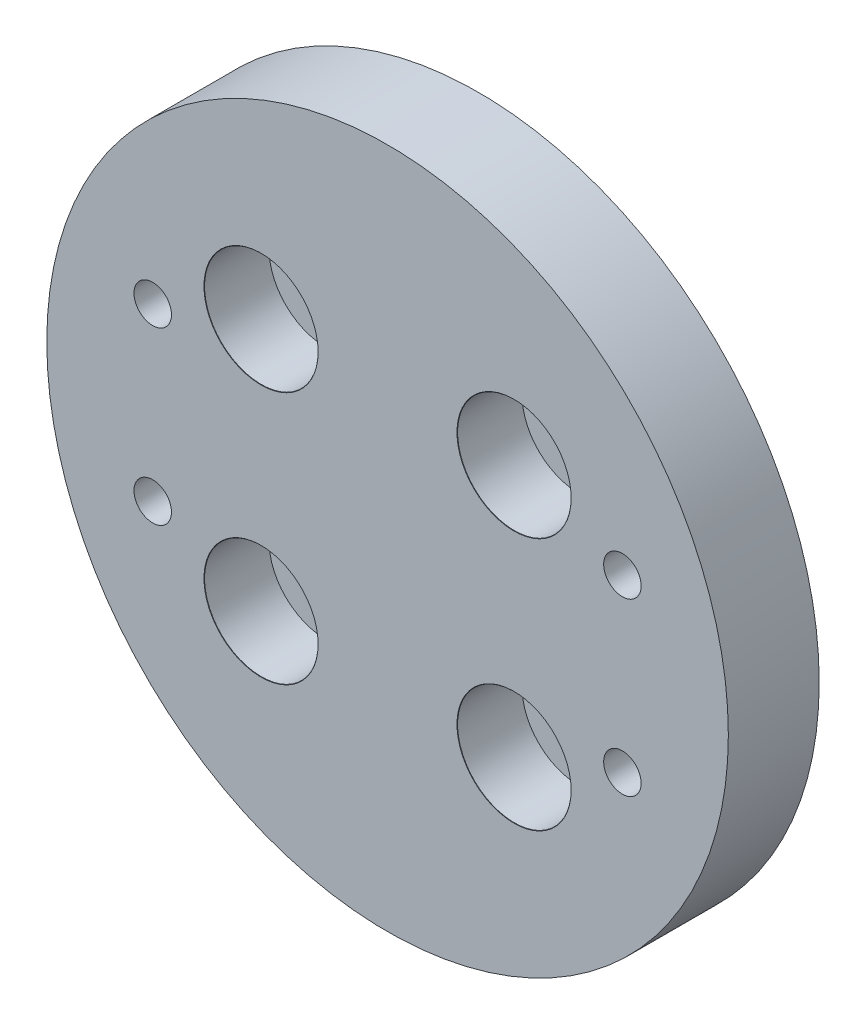
ISO-10303-21;
HEADER;
FILE_DESCRIPTION(('STEP AP214'),'2;1');
FILE_NAME('part.step','',(''),(''),'','','');
FILE_SCHEMA(('AUTOMOTIVE_DESIGN { 1 0 10303 214 1 1 1 1 }'));
ENDSEC;
DATA;
#1=APPLICATION_CONTEXT('core data for automotive mechanical design processes');
#2=APPLICATION_PROTOCOL_DEFINITION('international standard','automotive_design',2000,#1);
#3=PRODUCT_CONTEXT('',#1,'mechanical');
#4=PRODUCT('Part','Part','',(#3));
#5=PRODUCT_RELATED_PRODUCT_CATEGORY('part','',(#4));
#6=PRODUCT_DEFINITION_FORMATION('','',#4);
#7=PRODUCT_DEFINITION_CONTEXT('part definition',#1,'design');
#8=PRODUCT_DEFINITION('design','',#6,#7);
#9=PRODUCT_DEFINITION_SHAPE('','',#8);
#10=(LENGTH_UNIT() NAMED_UNIT(*) SI_UNIT(.MILLI.,.METRE.));
#11=(NAMED_UNIT(*) PLANE_ANGLE_UNIT() SI_UNIT($,.RADIAN.));
#12=(NAMED_UNIT(*) SI_UNIT($,.STERADIAN.) SOLID_ANGLE_UNIT());
#13=UNCERTAINTY_MEASURE_WITH_UNIT(LENGTH_MEASURE(1.E-05),#10,'distance_accuracy_value','');
#14=(GEOMETRIC_REPRESENTATION_CONTEXT(3) GLOBAL_UNCERTAINTY_ASSIGNED_CONTEXT((#13)) GLOBAL_UNIT_ASSIGNED_CONTEXT((#10,
#11,#12)) REPRESENTATION_CONTEXT('',''));
#15=CARTESIAN_POINT('',(0.,0.,0.));
#16=DIRECTION('',(0.,0.,1.));
#17=DIRECTION('',(1.,0.,0.));
#18=AXIS2_PLACEMENT_3D('',#15,#16,#17);
#19=CARTESIAN_POINT('',(0.,0.,8.));
#20=DIRECTION('',(0.,0.,-1.));
#21=DIRECTION('',(-1.,0.,0.));
#22=AXIS2_PLACEMENT_3D('',#19,#20,#21);
#23=CYLINDRICAL_SURFACE('',#22,30.);
#24=CARTESIAN_POINT('',(0.,0.,8.));
#25=DIRECTION('',(0.,0.,1.));
#26=DIRECTION('',(1.,0.,0.));
#27=AXIS2_PLACEMENT_3D('',#24,#25,#26);
#28=CIRCLE('',#27,30.);
#29=CARTESIAN_POINT('',(30.,0.,8.));
#30=VERTEX_POINT('',#29);
#31=EDGE_CURVE('E10',#30,#30,#28,.T.);
#32=ORIENTED_EDGE('',*,*,#31,.F.);
#33=EDGE_LOOP('',(#32));
#34=FACE_BOUND('',#33,.T.);
#35=CARTESIAN_POINT('',(0.,0.,0.));
#36=DIRECTION('',(0.,0.,1.));
#37=DIRECTION('',(1.,0.,0.));
#38=AXIS2_PLACEMENT_3D('',#35,#36,#37);
#39=CIRCLE('',#38,30.);
#40=CARTESIAN_POINT('',(30.,0.,0.));
#41=VERTEX_POINT('',#40);
#42=EDGE_CURVE('E39',#41,#41,#39,.T.);
#43=ORIENTED_EDGE('',*,*,#42,.T.);
#44=EDGE_LOOP('',(#43));
#45=FACE_BOUND('',#44,.T.);
#46=ADVANCED_FACE('F36',(#34,#45),#23,.T.);
#47=CARTESIAN_POINT('',(0.,0.,8.));
#48=DIRECTION('',(0.,0.,1.));
#49=DIRECTION('',(1.,0.,0.));
#50=AXIS2_PLACEMENT_3D('',#47,#48,#49);
#51=PLANE('',#50);
#52=CARTESIAN_POINT('',(20.67323765729,7.52444315316473,8.));
#53=DIRECTION('',(0.,0.,1.));
#54=DIRECTION('',(1.,0.,0.));
#55=AXIS2_PLACEMENT_3D('',#52,#53,#54);
#56=CIRCLE('',#55,1.64999999999999);
#57=CARTESIAN_POINT('',(22.32323765729,7.52444315316473,8.));
#58=VERTEX_POINT('',#57);
#59=EDGE_CURVE('E128',#58,#58,#56,.T.);
#60=ORIENTED_EDGE('',*,*,#59,.F.);
#61=EDGE_LOOP('',(#60));
#62=FACE_BOUND('',#61,.T.);
#63=CARTESIAN_POINT('',(20.67323765729,-7.52444315316473,8.));
#64=DIRECTION('',(0.,0.,1.));
#65=DIRECTION('',(1.,0.,0.));
#66=AXIS2_PLACEMENT_3D('',#63,#64,#65);
#67=CIRCLE('',#66,1.64999999999999);
#68=CARTESIAN_POINT('',(22.32323765729,-7.52444315316473,8.));
#69=VERTEX_POINT('',#68);
#70=EDGE_CURVE('E122',#69,#69,#67,.T.);
#71=ORIENTED_EDGE('',*,*,#70,.F.);
#72=EDGE_LOOP('',(#71));
#73=FACE_BOUND('',#72,.T.);
#74=CARTESIAN_POINT('',(-20.67323765729,7.52444315316473,8.));
#75=DIRECTION('',(0.,0.,1.));
#76=DIRECTION('',(1.,0.,0.));
#77=AXIS2_PLACEMENT_3D('',#74,#75,#76);
#78=CIRCLE('',#77,1.64999999999999);
#79=CARTESIAN_POINT('',(-19.02323765729,7.52444315316473,8.));
#80=VERTEX_POINT('',#79);
#81=EDGE_CURVE('E116',#80,#80,#78,.T.);
#82=ORIENTED_EDGE('',*,*,#81,.F.);
#83=EDGE_LOOP('',(#82));
#84=FACE_BOUND('',#83,.T.);
#85=CARTESIAN_POINT('',(-20.67323765729,-7.52444315316473,8.));
#86=DIRECTION('',(0.,0.,1.));
#87=DIRECTION('',(1.,0.,0.));
#88=AXIS2_PLACEMENT_3D('',#85,#86,#87);
#89=CIRCLE('',#88,1.64999999999999);
#90=CARTESIAN_POINT('',(-19.02323765729,-7.52444315316473,8.));
#91=VERTEX_POINT('',#90);
#92=EDGE_CURVE('E110',#91,#91,#89,.T.);
#93=ORIENTED_EDGE('',*,*,#92,.F.);
#94=EDGE_LOOP('',(#93));
#95=FACE_BOUND('',#94,.T.);
#96=CARTESIAN_POINT('',(-11.136931803688,-11.1369318036883,8.));
#97=DIRECTION('',(0.,0.,1.));
#98=DIRECTION('',(1.,0.,0.));
#99=AXIS2_PLACEMENT_3D('',#96,#97,#98);
#100=CIRCLE('',#99,5.025);
#101=CARTESIAN_POINT('',(-6.11193180368798,-11.1369318036883,8.));
#102=VERTEX_POINT('',#101);
#103=EDGE_CURVE('E104',#102,#102,#100,.T.);
#104=ORIENTED_EDGE('',*,*,#103,.F.);
#105=EDGE_LOOP('',(#104));
#106=FACE_BOUND('',#105,.T.);
#107=CARTESIAN_POINT('',(-11.1369318036881,11.1369318036881,8.));
#108=DIRECTION('',(0.,0.,1.));
#109=DIRECTION('',(1.,0.,0.));
#110=AXIS2_PLACEMENT_3D('',#107,#108,#109);
#111=CIRCLE('',#110,5.025);
#112=CARTESIAN_POINT('',(-6.11193180368814,11.1369318036881,8.));
#113=VERTEX_POINT('',#112);
#114=EDGE_CURVE('E89',#113,#113,#111,.T.);
#115=ORIENTED_EDGE('',*,*,#114,.F.);
#116=EDGE_LOOP('',(#115));
#117=FACE_BOUND('',#116,.T.);
#118=CARTESIAN_POINT('',(11.1369318036881,11.1369318036882,8.));
#119=DIRECTION('',(0.,0.,1.));
#120=DIRECTION('',(1.,0.,0.));
#121=AXIS2_PLACEMENT_3D('',#118,#119,#120);
#122=CIRCLE('',#121,5.025);
#123=CARTESIAN_POINT('',(16.1619318036881,11.1369318036882,8.));
#124=VERTEX_POINT('',#123);
#125=EDGE_CURVE('E74',#124,#124,#122,.T.);
#126=ORIENTED_EDGE('',*,*,#125,.F.);
#127=EDGE_LOOP('',(#126));
#128=FACE_BOUND('',#127,.T.);
#129=CARTESIAN_POINT('',(11.1369318036881,-11.1369318036881,8.));
#130=DIRECTION('',(0.,0.,1.));
#131=DIRECTION('',(1.,0.,0.));
#132=AXIS2_PLACEMENT_3D('',#129,#130,#131);
#133=CIRCLE('',#132,5.025);
#134=CARTESIAN_POINT('',(16.1619318036881,-11.1369318036881,8.));
#135=VERTEX_POINT('',#134);
#136=EDGE_CURVE('E59',#135,#135,#133,.T.);
#137=ORIENTED_EDGE('',*,*,#136,.F.);
#138=EDGE_LOOP('',(#137));
#139=FACE_BOUND('',#138,.T.);
#140=ORIENTED_EDGE('',*,*,#31,.T.);
#141=EDGE_LOOP('',(#140));
#142=FACE_BOUND('',#141,.T.);
#143=ADVANCED_FACE('F134',(#62,#73,#84,#95,#106,#117,#128,#139,#142),#51,.T.);
#144=CARTESIAN_POINT('',(0.,0.,0.));
#145=DIRECTION('',(0.,0.,1.));
#146=DIRECTION('',(1.,0.,0.));
#147=AXIS2_PLACEMENT_3D('',#144,#145,#146);
#148=PLANE('',#147);
#149=CARTESIAN_POINT('',(20.67323765729,7.52444315316473,0.));
#150=DIRECTION('',(0.,0.,1.));
#151=DIRECTION('',(1.,0.,0.));
#152=AXIS2_PLACEMENT_3D('',#149,#150,#151);
#153=CIRCLE('',#152,1.65);
#154=CARTESIAN_POINT('',(22.32323765729,7.52444315316473,0.));
#155=VERTEX_POINT('',#154);
#156=EDGE_CURVE('E125',#155,#155,#153,.T.);
#157=ORIENTED_EDGE('',*,*,#156,.T.);
#158=EDGE_LOOP('',(#157));
#159=FACE_BOUND('',#158,.T.);
#160=CARTESIAN_POINT('',(20.67323765729,-7.52444315316473,0.));
#161=DIRECTION('',(0.,0.,1.));
#162=DIRECTION('',(1.,0.,0.));
#163=AXIS2_PLACEMENT_3D('',#160,#161,#162);
#164=CIRCLE('',#163,1.65);
#165=CARTESIAN_POINT('',(22.32323765729,-7.52444315316473,0.));
#166=VERTEX_POINT('',#165);
#167=EDGE_CURVE('E119',#166,#166,#164,.T.);
#168=ORIENTED_EDGE('',*,*,#167,.T.);
#169=EDGE_LOOP('',(#168));
#170=FACE_BOUND('',#169,.T.);
#171=CARTESIAN_POINT('',(-20.67323765729,7.52444315316473,0.));
#172=DIRECTION('',(0.,0.,1.));
#173=DIRECTION('',(1.,0.,0.));
#174=AXIS2_PLACEMENT_3D('',#171,#172,#173);
#175=CIRCLE('',#174,1.65);
#176=CARTESIAN_POINT('',(-19.02323765729,7.52444315316473,0.));
#177=VERTEX_POINT('',#176);
#178=EDGE_CURVE('E113',#177,#177,#175,.T.);
#179=ORIENTED_EDGE('',*,*,#178,.T.);
#180=EDGE_LOOP('',(#179));
#181=FACE_BOUND('',#180,.T.);
#182=CARTESIAN_POINT('',(-20.67323765729,-7.52444315316473,0.));
#183=DIRECTION('',(0.,0.,1.));
#184=DIRECTION('',(1.,0.,0.));
#185=AXIS2_PLACEMENT_3D('',#182,#183,#184);
#186=CIRCLE('',#185,1.65);
#187=CARTESIAN_POINT('',(-19.02323765729,-7.52444315316473,0.));
#188=VERTEX_POINT('',#187);
#189=EDGE_CURVE('E107',#188,#188,#186,.T.);
#190=ORIENTED_EDGE('',*,*,#189,.T.);
#191=EDGE_LOOP('',(#190));
#192=FACE_BOUND('',#191,.T.);
#193=CARTESIAN_POINT('',(-11.136931803688,-11.1369318036883,0.));
#194=DIRECTION('',(0.,0.,1.));
#195=DIRECTION('',(1.,0.,0.));
#196=AXIS2_PLACEMENT_3D('',#193,#194,#195);
#197=CIRCLE('',#196,2.75);
#198=CARTESIAN_POINT('',(-8.38693180368798,-11.1369318036883,0.));
#199=VERTEX_POINT('',#198);
#200=EDGE_CURVE('E92',#199,#199,#197,.T.);
#201=ORIENTED_EDGE('',*,*,#200,.T.);
#202=EDGE_LOOP('',(#201));
#203=FACE_BOUND('',#202,.T.);
#204=CARTESIAN_POINT('',(-11.1369318036881,11.1369318036881,0.));
#205=DIRECTION('',(0.,0.,1.));
#206=DIRECTION('',(1.,0.,0.));
#207=AXIS2_PLACEMENT_3D('',#204,#205,#206);
#208=CIRCLE('',#207,2.75);
#209=CARTESIAN_POINT('',(-8.38693180368815,11.1369318036881,0.));
#210=VERTEX_POINT('',#209);
#211=EDGE_CURVE('E77',#210,#210,#208,.T.);
#212=ORIENTED_EDGE('',*,*,#211,.T.);
#213=EDGE_LOOP('',(#212));
#214=FACE_BOUND('',#213,.T.);
#215=CARTESIAN_POINT('',(11.1369318036881,11.1369318036882,0.));
#216=DIRECTION('',(0.,0.,1.));
#217=DIRECTION('',(1.,0.,0.));
#218=AXIS2_PLACEMENT_3D('',#215,#216,#217);
#219=CIRCLE('',#218,2.75);
#220=CARTESIAN_POINT('',(13.8869318036881,11.1369318036882,0.));
#221=VERTEX_POINT('',#220);
#222=EDGE_CURVE('E62',#221,#221,#219,.T.);
#223=ORIENTED_EDGE('',*,*,#222,.T.);
#224=EDGE_LOOP('',(#223));
#225=FACE_BOUND('',#224,.T.);
#226=CARTESIAN_POINT('',(11.1369318036881,-11.1369318036881,0.));
#227=DIRECTION('',(0.,0.,1.));
#228=DIRECTION('',(1.,0.,0.));
#229=AXIS2_PLACEMENT_3D('',#226,#227,#228);
#230=CIRCLE('',#229,2.75);
#231=CARTESIAN_POINT('',(13.8869318036881,-11.1369318036881,0.));
#232=VERTEX_POINT('',#231);
#233=EDGE_CURVE('E46',#232,#232,#230,.T.);
#234=ORIENTED_EDGE('',*,*,#233,.T.);
#235=EDGE_LOOP('',(#234));
#236=FACE_BOUND('',#235,.T.);
#237=ORIENTED_EDGE('',*,*,#42,.F.);
#238=EDGE_LOOP('',(#237));
#239=FACE_BOUND('',#238,.T.);
#240=ADVANCED_FACE('F137',(#159,#170,#181,#192,#203,#214,#225,#236,#239),#148,.F.);
#241=CARTESIAN_POINT('',(11.1369318036881,-11.1369318036881,8.));
#242=DIRECTION('',(0.,0.,1.));
#243=DIRECTION('',(1.,0.,0.));
#244=AXIS2_PLACEMENT_3D('',#241,#242,#243);
#245=CYLINDRICAL_SURFACE('',#244,2.75);
#246=ORIENTED_EDGE('',*,*,#233,.F.);
#247=EDGE_LOOP('',(#246));
#248=FACE_BOUND('',#247,.T.);
#249=CARTESIAN_POINT('',(11.1369318036881,-11.1369318036881,2.3));
#250=DIRECTION('',(0.,0.,1.));
#251=DIRECTION('',(1.,0.,0.));
#252=AXIS2_PLACEMENT_3D('',#249,#250,#251);
#253=CIRCLE('',#252,2.75);
#254=CARTESIAN_POINT('',(13.8869318036881,-11.1369318036881,2.3));
#255=VERTEX_POINT('',#254);
#256=EDGE_CURVE('E50',#255,#255,#253,.T.);
#257=ORIENTED_EDGE('',*,*,#256,.T.);
#258=EDGE_LOOP('',(#257));
#259=FACE_BOUND('',#258,.T.);
#260=ADVANCED_FACE('F178',(#248,#259),#245,.F.);
#261=CARTESIAN_POINT('',(16.1369318036881,-11.1369318036881,2.3));
#262=DIRECTION('',(0.,0.,-1.));
#263=DIRECTION('',(-1.,0.,0.));
#264=AXIS2_PLACEMENT_3D('',#261,#262,#263);
#265=PLANE('',#264);
#266=ORIENTED_EDGE('',*,*,#256,.F.);
#267=EDGE_LOOP('',(#266));
#268=FACE_BOUND('',#267,.T.);
#269=CARTESIAN_POINT('',(11.1369318036881,-11.1369318036881,2.3));
#270=DIRECTION('',(0.,0.,1.));
#271=DIRECTION('',(1.,0.,0.));
#272=AXIS2_PLACEMENT_3D('',#269,#270,#271);
#273=CIRCLE('',#272,5.);
#274=CARTESIAN_POINT('',(16.1369318036881,-11.1369318036881,2.3));
#275=VERTEX_POINT('',#274);
#276=EDGE_CURVE('E53',#275,#275,#273,.T.);
#277=ORIENTED_EDGE('',*,*,#276,.T.);
#278=EDGE_LOOP('',(#277));
#279=FACE_BOUND('',#278,.T.);
#280=ADVANCED_FACE('F166',(#268,#279),#265,.F.);
#281=CARTESIAN_POINT('',(11.1369318036881,-11.1369318036881,8.));
#282=DIRECTION('',(0.,0.,1.));
#283=DIRECTION('',(1.,0.,0.));
#284=AXIS2_PLACEMENT_3D('',#281,#282,#283);
#285=CYLINDRICAL_SURFACE('',#284,5.);
#286=ORIENTED_EDGE('',*,*,#276,.F.);
#287=EDGE_LOOP('',(#286));
#288=FACE_BOUND('',#287,.T.);
#289=CARTESIAN_POINT('',(11.1369318036881,-11.1369318036881,7.975));
#290=DIRECTION('',(0.,0.,1.));
#291=DIRECTION('',(1.,0.,0.));
#292=AXIS2_PLACEMENT_3D('',#289,#290,#291);
#293=CIRCLE('',#292,5.);
#294=CARTESIAN_POINT('',(16.1369318036881,-11.1369318036881,7.975));
#295=VERTEX_POINT('',#294);
#296=EDGE_CURVE('E56',#295,#295,#293,.T.);
#297=ORIENTED_EDGE('',*,*,#296,.T.);
#298=EDGE_LOOP('',(#297));
#299=FACE_BOUND('',#298,.T.);
#300=ADVANCED_FACE('F156',(#288,#299),#285,.F.);
#301=CARTESIAN_POINT('',(11.1369318036881,-11.1369318036881,8.));
#302=DIRECTION('',(0.,0.,1.));
#303=DIRECTION('',(1.,0.,0.));
#304=AXIS2_PLACEMENT_3D('',#301,#302,#303);
#305=CONICAL_SURFACE('',#304,5.025,0.785398163397379);
#306=ORIENTED_EDGE('',*,*,#296,.F.);
#307=EDGE_LOOP('',(#306));
#308=FACE_BOUND('',#307,.T.);
#309=ORIENTED_EDGE('',*,*,#136,.T.);
#310=EDGE_LOOP('',(#309));
#311=FACE_BOUND('',#310,.T.);
#312=ADVANCED_FACE('F153',(#308,#311),#305,.F.);
#313=CARTESIAN_POINT('',(11.1369318036881,11.1369318036882,8.));
#314=DIRECTION('',(0.,0.,1.));
#315=DIRECTION('',(1.,0.,0.));
#316=AXIS2_PLACEMENT_3D('',#313,#314,#315);
#317=CYLINDRICAL_SURFACE('',#316,2.75);
#318=ORIENTED_EDGE('',*,*,#222,.F.);
#319=EDGE_LOOP('',(#318));
#320=FACE_BOUND('',#319,.T.);
#321=CARTESIAN_POINT('',(11.1369318036881,11.1369318036882,2.3));
#322=DIRECTION('',(0.,0.,1.));
#323=DIRECTION('',(1.,0.,0.));
#324=AXIS2_PLACEMENT_3D('',#321,#322,#323);
#325=CIRCLE('',#324,2.75);
#326=CARTESIAN_POINT('',(13.8869318036881,11.1369318036882,2.3));
#327=VERTEX_POINT('',#326);
#328=EDGE_CURVE('E65',#327,#327,#325,.T.);
#329=ORIENTED_EDGE('',*,*,#328,.T.);
#330=EDGE_LOOP('',(#329));
#331=FACE_BOUND('',#330,.T.);
#332=ADVANCED_FACE('F155',(#320,#331),#317,.F.);
#333=CARTESIAN_POINT('',(16.1369318036881,11.1369318036882,2.3));
#334=DIRECTION('',(0.,0.,-1.));
#335=DIRECTION('',(-1.,0.,0.));
#336=AXIS2_PLACEMENT_3D('',#333,#334,#335);
#337=PLANE('',#336);
#338=ORIENTED_EDGE('',*,*,#328,.F.);
#339=EDGE_LOOP('',(#338));
#340=FACE_BOUND('',#339,.T.);
#341=CARTESIAN_POINT('',(11.1369318036881,11.1369318036882,2.3));
#342=DIRECTION('',(0.,0.,1.));
#343=DIRECTION('',(1.,0.,0.));
#344=AXIS2_PLACEMENT_3D('',#341,#342,#343);
#345=CIRCLE('',#344,5.);
#346=CARTESIAN_POINT('',(16.1369318036881,11.1369318036882,2.3));
#347=VERTEX_POINT('',#346);
#348=EDGE_CURVE('E68',#347,#347,#345,.T.);
#349=ORIENTED_EDGE('',*,*,#348,.T.);
#350=EDGE_LOOP('',(#349));
#351=FACE_BOUND('',#350,.T.);
#352=ADVANCED_FACE('F163',(#340,#351),#337,.F.);
#353=CARTESIAN_POINT('',(11.1369318036881,11.1369318036882,8.));
#354=DIRECTION('',(0.,0.,1.));
#355=DIRECTION('',(1.,0.,0.));
#356=AXIS2_PLACEMENT_3D('',#353,#354,#355);
#357=CYLINDRICAL_SURFACE('',#356,5.);
#358=ORIENTED_EDGE('',*,*,#348,.F.);
#359=EDGE_LOOP('',(#358));
#360=FACE_BOUND('',#359,.T.);
#361=CARTESIAN_POINT('',(11.1369318036881,11.1369318036882,7.975));
#362=DIRECTION('',(0.,0.,1.));
#363=DIRECTION('',(1.,0.,0.));
#364=AXIS2_PLACEMENT_3D('',#361,#362,#363);
#365=CIRCLE('',#364,5.);
#366=CARTESIAN_POINT('',(16.1369318036881,11.1369318036882,7.975));
#367=VERTEX_POINT('',#366);
#368=EDGE_CURVE('E71',#367,#367,#365,.T.);
#369=ORIENTED_EDGE('',*,*,#368,.T.);
#370=EDGE_LOOP('',(#369));
#371=FACE_BOUND('',#370,.T.);
#372=ADVANCED_FACE('F221',(#360,#371),#357,.F.);
#373=CARTESIAN_POINT('',(11.1369318036881,11.1369318036882,8.));
#374=DIRECTION('',(0.,0.,1.));
#375=DIRECTION('',(1.,0.,0.));
#376=AXIS2_PLACEMENT_3D('',#373,#374,#375);
#377=CONICAL_SURFACE('',#376,5.025,0.785398163397379);
#378=ORIENTED_EDGE('',*,*,#368,.F.);
#379=EDGE_LOOP('',(#378));
#380=FACE_BOUND('',#379,.T.);
#381=ORIENTED_EDGE('',*,*,#125,.T.);
#382=EDGE_LOOP('',(#381));
#383=FACE_BOUND('',#382,.T.);
#384=ADVANCED_FACE('F231',(#380,#383),#377,.F.);
#385=CARTESIAN_POINT('',(-11.1369318036881,11.1369318036881,8.));
#386=DIRECTION('',(0.,0.,1.));
#387=DIRECTION('',(1.,0.,0.));
#388=AXIS2_PLACEMENT_3D('',#385,#386,#387);
#389=CYLINDRICAL_SURFACE('',#388,2.75);
#390=ORIENTED_EDGE('',*,*,#211,.F.);
#391=EDGE_LOOP('',(#390));
#392=FACE_BOUND('',#391,.T.);
#393=CARTESIAN_POINT('',(-11.1369318036881,11.1369318036881,2.3));
#394=DIRECTION('',(0.,0.,1.));
#395=DIRECTION('',(1.,0.,0.));
#396=AXIS2_PLACEMENT_3D('',#393,#394,#395);
#397=CIRCLE('',#396,2.75);
#398=CARTESIAN_POINT('',(-8.38693180368815,11.1369318036881,2.3));
#399=VERTEX_POINT('',#398);
#400=EDGE_CURVE('E80',#399,#399,#397,.T.);
#401=ORIENTED_EDGE('',*,*,#400,.T.);
#402=EDGE_LOOP('',(#401));
#403=FACE_BOUND('',#402,.T.);
#404=ADVANCED_FACE('F241',(#392,#403),#389,.F.);
#405=CARTESIAN_POINT('',(-6.13693180368815,11.1369318036881,2.3));
#406=DIRECTION('',(0.,0.,-1.));
#407=DIRECTION('',(-1.,0.,0.));
#408=AXIS2_PLACEMENT_3D('',#405,#406,#407);
#409=PLANE('',#408);
#410=ORIENTED_EDGE('',*,*,#400,.F.);
#411=EDGE_LOOP('',(#410));
#412=FACE_BOUND('',#411,.T.);
#413=CARTESIAN_POINT('',(-11.1369318036881,11.1369318036881,2.3));
#414=DIRECTION('',(0.,0.,1.));
#415=DIRECTION('',(1.,0.,0.));
#416=AXIS2_PLACEMENT_3D('',#413,#414,#415);
#417=CIRCLE('',#416,5.);
#418=CARTESIAN_POINT('',(-6.13693180368815,11.1369318036881,2.3));
#419=VERTEX_POINT('',#418);
#420=EDGE_CURVE('E83',#419,#419,#417,.T.);
#421=ORIENTED_EDGE('',*,*,#420,.T.);
#422=EDGE_LOOP('',(#421));
#423=FACE_BOUND('',#422,.T.);
#424=ADVANCED_FACE('F251',(#412,#423),#409,.F.);
#425=CARTESIAN_POINT('',(-11.1369318036881,11.1369318036881,8.));
#426=DIRECTION('',(0.,0.,1.));
#427=DIRECTION('',(1.,0.,0.));
#428=AXIS2_PLACEMENT_3D('',#425,#426,#427);
#429=CYLINDRICAL_SURFACE('',#428,5.);
#430=ORIENTED_EDGE('',*,*,#420,.F.);
#431=EDGE_LOOP('',(#430));
#432=FACE_BOUND('',#431,.T.);
#433=CARTESIAN_POINT('',(-11.1369318036881,11.1369318036881,7.975));
#434=DIRECTION('',(0.,0.,1.));
#435=DIRECTION('',(1.,0.,0.));
#436=AXIS2_PLACEMENT_3D('',#433,#434,#435);
#437=CIRCLE('',#436,5.);
#438=CARTESIAN_POINT('',(-6.13693180368815,11.1369318036881,7.975));
#439=VERTEX_POINT('',#438);
#440=EDGE_CURVE('E86',#439,#439,#437,.T.);
#441=ORIENTED_EDGE('',*,*,#440,.T.);
#442=EDGE_LOOP('',(#441));
#443=FACE_BOUND('',#442,.T.);
#444=ADVANCED_FACE('F261',(#432,#443),#429,.F.);
#445=CARTESIAN_POINT('',(-11.1369318036881,11.1369318036881,8.));
#446=DIRECTION('',(0.,0.,1.));
#447=DIRECTION('',(1.,0.,0.));
#448=AXIS2_PLACEMENT_3D('',#445,#446,#447);
#449=CONICAL_SURFACE('',#448,5.025,0.785398163397396);
#450=ORIENTED_EDGE('',*,*,#440,.F.);
#451=EDGE_LOOP('',(#450));
#452=FACE_BOUND('',#451,.T.);
#453=ORIENTED_EDGE('',*,*,#114,.T.);
#454=EDGE_LOOP('',(#453));
#455=FACE_BOUND('',#454,.T.);
#456=ADVANCED_FACE('F271',(#452,#455),#449,.F.);
#457=CARTESIAN_POINT('',(-11.136931803688,-11.1369318036883,8.));
#458=DIRECTION('',(0.,0.,1.));
#459=DIRECTION('',(1.,0.,0.));
#460=AXIS2_PLACEMENT_3D('',#457,#458,#459);
#461=CYLINDRICAL_SURFACE('',#460,2.75);
#462=ORIENTED_EDGE('',*,*,#200,.F.);
#463=EDGE_LOOP('',(#462));
#464=FACE_BOUND('',#463,.T.);
#465=CARTESIAN_POINT('',(-11.136931803688,-11.1369318036883,2.3));
#466=DIRECTION('',(0.,0.,1.));
#467=DIRECTION('',(1.,0.,0.));
#468=AXIS2_PLACEMENT_3D('',#465,#466,#467);
#469=CIRCLE('',#468,2.75);
#470=CARTESIAN_POINT('',(-8.38693180368799,-11.1369318036883,2.3));
#471=VERTEX_POINT('',#470);
#472=EDGE_CURVE('E95',#471,#471,#469,.T.);
#473=ORIENTED_EDGE('',*,*,#472,.T.);
#474=EDGE_LOOP('',(#473));
#475=FACE_BOUND('',#474,.T.);
#476=ADVANCED_FACE('F281',(#464,#475),#461,.F.);
#477=CARTESIAN_POINT('',(-6.13693180368799,-11.1369318036883,2.3));
#478=DIRECTION('',(0.,0.,-1.));
#479=DIRECTION('',(-1.,0.,0.));
#480=AXIS2_PLACEMENT_3D('',#477,#478,#479);
#481=PLANE('',#480);
#482=ORIENTED_EDGE('',*,*,#472,.F.);
#483=EDGE_LOOP('',(#482));
#484=FACE_BOUND('',#483,.T.);
#485=CARTESIAN_POINT('',(-11.136931803688,-11.1369318036883,2.3));
#486=DIRECTION('',(0.,0.,1.));
#487=DIRECTION('',(1.,0.,0.));
#488=AXIS2_PLACEMENT_3D('',#485,#486,#487);
#489=CIRCLE('',#488,5.);
#490=CARTESIAN_POINT('',(-6.13693180368799,-11.1369318036883,2.3));
#491=VERTEX_POINT('',#490);
#492=EDGE_CURVE('E98',#491,#491,#489,.T.);
#493=ORIENTED_EDGE('',*,*,#492,.T.);
#494=EDGE_LOOP('',(#493));
#495=FACE_BOUND('',#494,.T.);
#496=ADVANCED_FACE('F291',(#484,#495),#481,.F.);
#497=CARTESIAN_POINT('',(-11.136931803688,-11.1369318036883,8.));
#498=DIRECTION('',(0.,0.,1.));
#499=DIRECTION('',(1.,0.,0.));
#500=AXIS2_PLACEMENT_3D('',#497,#498,#499);
#501=CYLINDRICAL_SURFACE('',#500,5.);
#502=ORIENTED_EDGE('',*,*,#492,.F.);
#503=EDGE_LOOP('',(#502));
#504=FACE_BOUND('',#503,.T.);
#505=CARTESIAN_POINT('',(-11.136931803688,-11.1369318036883,7.975));
#506=DIRECTION('',(0.,0.,1.));
#507=DIRECTION('',(1.,0.,0.));
#508=AXIS2_PLACEMENT_3D('',#505,#506,#507);
#509=CIRCLE('',#508,5.);
#510=CARTESIAN_POINT('',(-6.13693180368799,-11.1369318036883,7.975));
#511=VERTEX_POINT('',#510);
#512=EDGE_CURVE('E101',#511,#511,#509,.T.);
#513=ORIENTED_EDGE('',*,*,#512,.T.);
#514=EDGE_LOOP('',(#513));
#515=FACE_BOUND('',#514,.T.);
#516=ADVANCED_FACE('F301',(#504,#515),#501,.F.);
#517=CARTESIAN_POINT('',(-11.136931803688,-11.1369318036883,8.));
#518=DIRECTION('',(0.,0.,1.));
#519=DIRECTION('',(1.,0.,0.));
#520=AXIS2_PLACEMENT_3D('',#517,#518,#519);
#521=CONICAL_SURFACE('',#520,5.025,0.785398163397396);
#522=ORIENTED_EDGE('',*,*,#512,.F.);
#523=EDGE_LOOP('',(#522));
#524=FACE_BOUND('',#523,.T.);
#525=ORIENTED_EDGE('',*,*,#103,.T.);
#526=EDGE_LOOP('',(#525));
#527=FACE_BOUND('',#526,.T.);
#528=ADVANCED_FACE('F311',(#524,#527),#521,.F.);
#529=CARTESIAN_POINT('',(-20.67323765729,-7.52444315316473,8.));
#530=DIRECTION('',(0.,0.,1.));
#531=DIRECTION('',(1.,0.,0.));
#532=AXIS2_PLACEMENT_3D('',#529,#530,#531);
#533=CYLINDRICAL_SURFACE('',#532,1.64999999999999);
#534=ORIENTED_EDGE('',*,*,#189,.F.);
#535=EDGE_LOOP('',(#534));
#536=FACE_BOUND('',#535,.T.);
#537=ORIENTED_EDGE('',*,*,#92,.T.);
#538=EDGE_LOOP('',(#537));
#539=FACE_BOUND('',#538,.T.);
#540=ADVANCED_FACE('F321',(#536,#539),#533,.F.);
#541=CARTESIAN_POINT('',(-20.67323765729,7.52444315316473,8.));
#542=DIRECTION('',(0.,0.,1.));
#543=DIRECTION('',(1.,0.,0.));
#544=AXIS2_PLACEMENT_3D('',#541,#542,#543);
#545=CYLINDRICAL_SURFACE('',#544,1.64999999999999);
#546=ORIENTED_EDGE('',*,*,#178,.F.);
#547=EDGE_LOOP('',(#546));
#548=FACE_BOUND('',#547,.T.);
#549=ORIENTED_EDGE('',*,*,#81,.T.);
#550=EDGE_LOOP('',(#549));
#551=FACE_BOUND('',#550,.T.);
#552=ADVANCED_FACE('F348',(#548,#551),#545,.F.);
#553=CARTESIAN_POINT('',(20.67323765729,-7.52444315316473,8.));
#554=DIRECTION('',(0.,0.,1.));
#555=DIRECTION('',(1.,0.,0.));
#556=AXIS2_PLACEMENT_3D('',#553,#554,#555);
#557=CYLINDRICAL_SURFACE('',#556,1.64999999999999);
#558=ORIENTED_EDGE('',*,*,#167,.F.);
#559=EDGE_LOOP('',(#558));
#560=FACE_BOUND('',#559,.T.);
#561=ORIENTED_EDGE('',*,*,#70,.T.);
#562=EDGE_LOOP('',(#561));
#563=FACE_BOUND('',#562,.T.);
#564=ADVANCED_FACE('F359',(#560,#563),#557,.F.);
#565=CARTESIAN_POINT('',(20.67323765729,7.52444315316473,8.));
#566=DIRECTION('',(0.,0.,1.));
#567=DIRECTION('',(1.,0.,0.));
#568=AXIS2_PLACEMENT_3D('',#565,#566,#567);
#569=CYLINDRICAL_SURFACE('',#568,1.64999999999999);
#570=ORIENTED_EDGE('',*,*,#156,.F.);
#571=EDGE_LOOP('',(#570));
#572=FACE_BOUND('',#571,.T.);
#573=ORIENTED_EDGE('',*,*,#59,.T.);
#574=EDGE_LOOP('',(#573));
#575=FACE_BOUND('',#574,.T.);
#576=ADVANCED_FACE('F132',(#572,#575),#569,.F.);
#577=CLOSED_SHELL('',(#46,#143,#240,#260,#280,#300,#312,#332,#352,#372,#384,#404,#424,#444,#456,
#476,#496,#516,#528,#540,#552,#564,#576));
#578=MANIFOLD_SOLID_BREP('B2',#577);
#579=ADVANCED_BREP_SHAPE_REPRESENTATION('',(#18,#578),#14);
#580=SHAPE_DEFINITION_REPRESENTATION(#9,#579);
ENDSEC;
END-ISO-10303-21;
